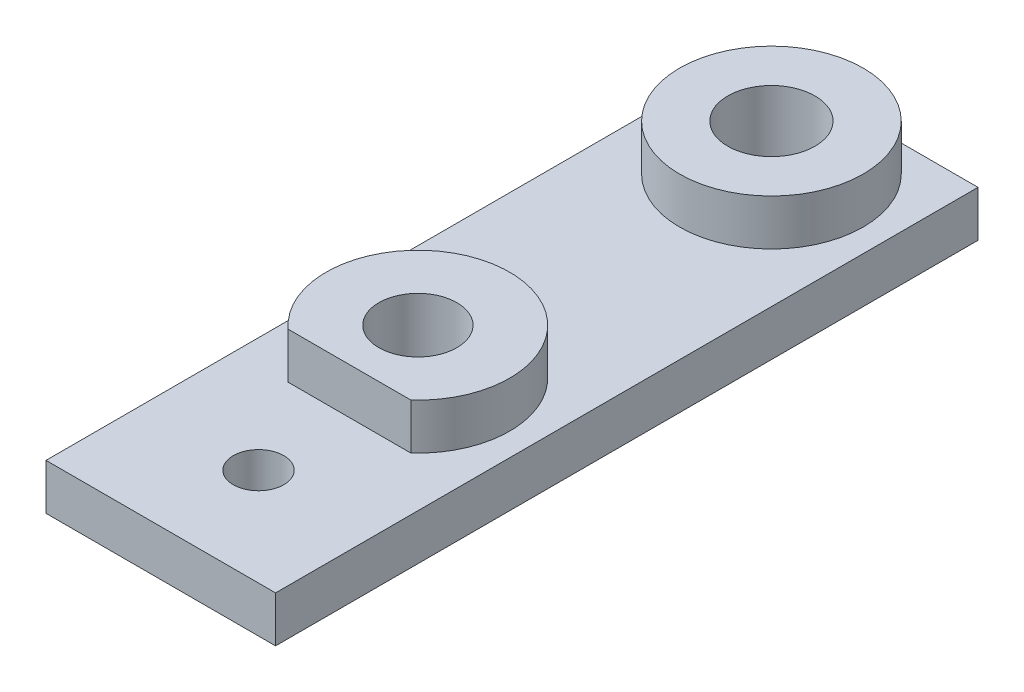
ISO-10303-21;
HEADER;
FILE_DESCRIPTION(('STEP AP214'),'2;1');
FILE_NAME('part.step','',(''),(''),'','','');
FILE_SCHEMA(('AUTOMOTIVE_DESIGN { 1 0 10303 214 1 1 1 1 }'));
ENDSEC;
DATA;
#1=APPLICATION_CONTEXT('core data for automotive mechanical design processes');
#2=APPLICATION_PROTOCOL_DEFINITION('international standard','automotive_design',2000,#1);
#3=PRODUCT_CONTEXT('',#1,'mechanical');
#4=PRODUCT('Part','Part','',(#3));
#5=PRODUCT_RELATED_PRODUCT_CATEGORY('part','',(#4));
#6=PRODUCT_DEFINITION_FORMATION('','',#4);
#7=PRODUCT_DEFINITION_CONTEXT('part definition',#1,'design');
#8=PRODUCT_DEFINITION('design','',#6,#7);
#9=PRODUCT_DEFINITION_SHAPE('','',#8);
#10=(LENGTH_UNIT() NAMED_UNIT(*) SI_UNIT(.MILLI.,.METRE.));
#11=(NAMED_UNIT(*) PLANE_ANGLE_UNIT() SI_UNIT($,.RADIAN.));
#12=(NAMED_UNIT(*) SI_UNIT($,.STERADIAN.) SOLID_ANGLE_UNIT());
#13=UNCERTAINTY_MEASURE_WITH_UNIT(LENGTH_MEASURE(1.E-05),#10,'distance_accuracy_value','');
#14=(GEOMETRIC_REPRESENTATION_CONTEXT(3) GLOBAL_UNCERTAINTY_ASSIGNED_CONTEXT((#13)) GLOBAL_UNIT_ASSIGNED_CONTEXT((#10,
#11,#12)) REPRESENTATION_CONTEXT('',''));
#15=CARTESIAN_POINT('',(0.,0.,0.));
#16=DIRECTION('',(0.,0.,1.));
#17=DIRECTION('',(1.,0.,0.));
#18=AXIS2_PLACEMENT_3D('',#15,#16,#17);
#19=CARTESIAN_POINT('',(0.,5.,0.));
#20=DIRECTION('',(0.,1.,0.));
#21=DIRECTION('',(0.,0.,1.));
#22=AXIS2_PLACEMENT_3D('',#19,#20,#21);
#23=PLANE('',#22);
#24=DIRECTION('',(-1.,0.,0.));
#25=VECTOR('',#24,1.);
#26=CARTESIAN_POINT('',(-39.4811320754717,5.,-27.2735849056604));
#27=LINE('',#26,#25);
#28=CARTESIAN_POINT('',(-14.4811320754717,5.,-27.2735849056603));
#29=VERTEX_POINT('',#28);
#30=CARTESIAN_POINT('',(-26.9811320754717,5.,-27.2735849056604));
#31=VERTEX_POINT('',#30);
#32=EDGE_CURVE('E87',#29,#31,#27,.T.);
#33=ORIENTED_EDGE('',*,*,#32,.T.);
#34=CARTESIAN_POINT('',(-26.9811320754717,5.,-17.2735849056604));
#35=DIRECTION('',(0.,1.,0.));
#36=DIRECTION('',(0.,0.,1.));
#37=AXIS2_PLACEMENT_3D('',#34,#35,#36);
#38=CIRCLE('',#37,10.);
#39=EDGE_CURVE('E119',#31,#31,#38,.T.);
#40=ORIENTED_EDGE('',*,*,#39,.F.);
#41=CARTESIAN_POINT('',(-39.4811320754717,5.,-27.2735849056604));
#42=VERTEX_POINT('',#41);
#43=EDGE_CURVE('E144',#31,#42,#27,.T.);
#44=ORIENTED_EDGE('',*,*,#43,.T.);
#45=DIRECTION('',(0.,0.,1.));
#46=VECTOR('',#45,1.);
#47=CARTESIAN_POINT('',(-39.4811320754717,5.,-27.2735849056604));
#48=LINE('',#47,#46);
#49=CARTESIAN_POINT('',(-39.4811320754717,5.,49.2264150943397));
#50=VERTEX_POINT('',#49);
#51=EDGE_CURVE('E146',#42,#50,#48,.T.);
#52=ORIENTED_EDGE('',*,*,#51,.T.);
#53=DIRECTION('',(1.,0.,0.));
#54=VECTOR('',#53,1.);
#55=CARTESIAN_POINT('',(-39.4811320754717,5.,49.2264150943397));
#56=LINE('',#55,#54);
#57=CARTESIAN_POINT('',(-14.4811320754717,5.,49.2264150943397));
#58=VERTEX_POINT('',#57);
#59=EDGE_CURVE('E59',#50,#58,#56,.T.);
#60=ORIENTED_EDGE('',*,*,#59,.T.);
#61=DIRECTION('',(0.,0.,-1.));
#62=VECTOR('',#61,1.);
#63=CARTESIAN_POINT('',(-14.4811320754717,5.,-27.2735849056603));
#64=LINE('',#63,#62);
#65=EDGE_CURVE('E142',#58,#29,#64,.T.);
#66=ORIENTED_EDGE('',*,*,#65,.T.);
#67=EDGE_LOOP('',(#33,#40,#44,#52,#60,#66));
#68=FACE_BOUND('',#67,.T.);
#69=CARTESIAN_POINT('',(-26.9811320754717,5.,38.5800085191015));
#70=DIRECTION('',(0.,-1.,0.));
#71=DIRECTION('',(0.,0.,-1.));
#72=AXIS2_PLACEMENT_3D('',#69,#70,#71);
#73=CIRCLE('',#72,2.75);
#74=CARTESIAN_POINT('',(-26.9811320754717,5.,35.8300085191015));
#75=VERTEX_POINT('',#74);
#76=EDGE_CURVE('E130',#75,#75,#73,.T.);
#77=ORIENTED_EDGE('',*,*,#76,.T.);
#78=EDGE_LOOP('',(#77));
#79=FACE_BOUND('',#78,.T.);
#80=DIRECTION('',(1.,0.,0.));
#81=VECTOR('',#80,1.);
#82=CARTESIAN_POINT('',(-33.6584511695804,5.,28.6704334792882));
#83=LINE('',#82,#81);
#84=CARTESIAN_POINT('',(-33.6584511695804,5.,28.6704334792882));
#85=VERTEX_POINT('',#84);
#86=CARTESIAN_POINT('',(-20.3038129813631,5.,28.6704334792882));
#87=VERTEX_POINT('',#86);
#88=EDGE_CURVE('E113',#85,#87,#83,.T.);
#89=ORIENTED_EDGE('',*,*,#88,.F.);
#90=CARTESIAN_POINT('',(-26.9811320754717,5.,21.2264150943396));
#91=DIRECTION('',(0.,1.,0.));
#92=DIRECTION('',(0.,0.,1.));
#93=AXIS2_PLACEMENT_3D('',#90,#91,#92);
#94=CIRCLE('',#93,10.);
#95=EDGE_CURVE('E50',#87,#85,#94,.T.);
#96=ORIENTED_EDGE('',*,*,#95,.F.);
#97=EDGE_LOOP('',(#89,#96));
#98=FACE_BOUND('',#97,.T.);
#99=ADVANCED_FACE('F35',(#68,#79,#98),#23,.T.);
#100=CARTESIAN_POINT('',(0.,0.,0.));
#101=DIRECTION('',(0.,1.,0.));
#102=DIRECTION('',(0.,0.,1.));
#103=AXIS2_PLACEMENT_3D('',#100,#101,#102);
#104=PLANE('',#103);
#105=CARTESIAN_POINT('',(-26.9811320754717,0.,38.5800085191015));
#106=DIRECTION('',(0.,-1.,0.));
#107=DIRECTION('',(0.,0.,-1.));
#108=AXIS2_PLACEMENT_3D('',#105,#106,#107);
#109=CIRCLE('',#108,2.75);
#110=CARTESIAN_POINT('',(-26.9811320754717,0.,35.8300085191015));
#111=VERTEX_POINT('',#110);
#112=EDGE_CURVE('E127',#111,#111,#109,.T.);
#113=ORIENTED_EDGE('',*,*,#112,.F.);
#114=EDGE_LOOP('',(#113));
#115=FACE_BOUND('',#114,.T.);
#116=DIRECTION('',(0.,0.,-1.));
#117=VECTOR('',#116,1.);
#118=CARTESIAN_POINT('',(-14.4811320754717,0.,-27.2735849056603));
#119=LINE('',#118,#117);
#120=CARTESIAN_POINT('',(-14.4811320754717,0.,49.2264150943397));
#121=VERTEX_POINT('',#120);
#122=CARTESIAN_POINT('',(-14.4811320754717,0.,-27.2735849056603));
#123=VERTEX_POINT('',#122);
#124=EDGE_CURVE('E141',#121,#123,#119,.T.);
#125=ORIENTED_EDGE('',*,*,#124,.F.);
#126=DIRECTION('',(1.,0.,0.));
#127=VECTOR('',#126,1.);
#128=CARTESIAN_POINT('',(-39.4811320754717,0.,49.2264150943397));
#129=LINE('',#128,#127);
#130=CARTESIAN_POINT('',(-39.4811320754717,0.,49.2264150943397));
#131=VERTEX_POINT('',#130);
#132=EDGE_CURVE('E80',#131,#121,#129,.T.);
#133=ORIENTED_EDGE('',*,*,#132,.F.);
#134=DIRECTION('',(0.,0.,1.));
#135=VECTOR('',#134,1.);
#136=CARTESIAN_POINT('',(-39.4811320754717,0.,-27.2735849056604));
#137=LINE('',#136,#135);
#138=CARTESIAN_POINT('',(-39.4811320754717,0.,-27.2735849056604));
#139=VERTEX_POINT('',#138);
#140=EDGE_CURVE('E154',#139,#131,#137,.T.);
#141=ORIENTED_EDGE('',*,*,#140,.F.);
#142=DIRECTION('',(-1.,0.,0.));
#143=VECTOR('',#142,1.);
#144=CARTESIAN_POINT('',(-39.4811320754717,0.,-27.2735849056604));
#145=LINE('',#144,#143);
#146=EDGE_CURVE('E152',#123,#139,#145,.T.);
#147=ORIENTED_EDGE('',*,*,#146,.F.);
#148=EDGE_LOOP('',(#125,#133,#141,#147));
#149=FACE_BOUND('',#148,.T.);
#150=CARTESIAN_POINT('',(-26.9811320754717,0.,-17.2735849056604));
#151=DIRECTION('',(0.,1.,0.));
#152=DIRECTION('',(0.,0.,1.));
#153=AXIS2_PLACEMENT_3D('',#150,#151,#152);
#154=CIRCLE('',#153,4.75);
#155=CARTESIAN_POINT('',(-26.9811320754717,0.,-12.5235849056604));
#156=VERTEX_POINT('',#155);
#157=EDGE_CURVE('E138',#156,#156,#154,.T.);
#158=ORIENTED_EDGE('',*,*,#157,.T.);
#159=EDGE_LOOP('',(#158));
#160=FACE_BOUND('',#159,.T.);
#161=CARTESIAN_POINT('',(-26.9811320754717,0.,21.2264150943396));
#162=DIRECTION('',(0.,1.,0.));
#163=DIRECTION('',(0.,0.,1.));
#164=AXIS2_PLACEMENT_3D('',#161,#162,#163);
#165=CIRCLE('',#164,4.25);
#166=CARTESIAN_POINT('',(-26.9811320754717,0.,25.4764150943396));
#167=VERTEX_POINT('',#166);
#168=EDGE_CURVE('E133',#167,#167,#165,.T.);
#169=ORIENTED_EDGE('',*,*,#168,.T.);
#170=EDGE_LOOP('',(#169));
#171=FACE_BOUND('',#170,.T.);
#172=ADVANCED_FACE('F168',(#115,#149,#160,#171),#104,.F.);
#173=CARTESIAN_POINT('',(-14.4811320754717,5.,-27.2735849056603));
#174=DIRECTION('',(-1.,0.,0.));
#175=DIRECTION('',(0.,0.,1.));
#176=AXIS2_PLACEMENT_3D('',#173,#174,#175);
#177=PLANE('',#176);
#178=ORIENTED_EDGE('',*,*,#124,.T.);
#179=DIRECTION('',(0.,-1.,0.));
#180=VECTOR('',#179,1.);
#181=CARTESIAN_POINT('',(-14.4811320754717,5.,-27.2735849056603));
#182=LINE('',#181,#180);
#183=EDGE_CURVE('E11',#29,#123,#182,.T.);
#184=ORIENTED_EDGE('',*,*,#183,.F.);
#185=ORIENTED_EDGE('',*,*,#65,.F.);
#186=DIRECTION('',(0.,-1.,0.));
#187=VECTOR('',#186,1.);
#188=CARTESIAN_POINT('',(-14.4811320754717,5.,49.2264150943397));
#189=LINE('',#188,#187);
#190=EDGE_CURVE('E149',#58,#121,#189,.T.);
#191=ORIENTED_EDGE('',*,*,#190,.T.);
#192=EDGE_LOOP('',(#178,#184,#185,#191));
#193=FACE_BOUND('',#192,.T.);
#194=ADVANCED_FACE('F37',(#193),#177,.F.);
#195=CARTESIAN_POINT('',(-39.4811320754717,5.,-27.2735849056604));
#196=DIRECTION('',(0.,0.,1.));
#197=DIRECTION('',(1.,0.,0.));
#198=AXIS2_PLACEMENT_3D('',#195,#196,#197);
#199=PLANE('',#198);
#200=ORIENTED_EDGE('',*,*,#146,.T.);
#201=DIRECTION('',(0.,-1.,0.));
#202=VECTOR('',#201,1.);
#203=CARTESIAN_POINT('',(-39.4811320754717,5.,-27.2735849056604));
#204=LINE('',#203,#202);
#205=EDGE_CURVE('E43',#42,#139,#204,.T.);
#206=ORIENTED_EDGE('',*,*,#205,.F.);
#207=ORIENTED_EDGE('',*,*,#43,.F.);
#208=ORIENTED_EDGE('',*,*,#32,.F.);
#209=ORIENTED_EDGE('',*,*,#183,.T.);
#210=EDGE_LOOP('',(#200,#206,#207,#208,#209));
#211=FACE_BOUND('',#210,.T.);
#212=ADVANCED_FACE('F184',(#211),#199,.F.);
#213=CARTESIAN_POINT('',(-39.4811320754717,5.,-27.2735849056604));
#214=DIRECTION('',(1.,0.,0.));
#215=DIRECTION('',(0.,0.,-1.));
#216=AXIS2_PLACEMENT_3D('',#213,#214,#215);
#217=PLANE('',#216);
#218=ORIENTED_EDGE('',*,*,#140,.T.);
#219=DIRECTION('',(0.,-1.,0.));
#220=VECTOR('',#219,1.);
#221=CARTESIAN_POINT('',(-39.4811320754717,5.,49.2264150943397));
#222=LINE('',#221,#220);
#223=EDGE_CURVE('E158',#50,#131,#222,.T.);
#224=ORIENTED_EDGE('',*,*,#223,.F.);
#225=ORIENTED_EDGE('',*,*,#51,.F.);
#226=ORIENTED_EDGE('',*,*,#205,.T.);
#227=EDGE_LOOP('',(#218,#224,#225,#226));
#228=FACE_BOUND('',#227,.T.);
#229=ADVANCED_FACE('F164',(#228),#217,.F.);
#230=CARTESIAN_POINT('',(-39.4811320754717,5.,49.2264150943397));
#231=DIRECTION('',(0.,0.,-1.));
#232=DIRECTION('',(-1.,0.,0.));
#233=AXIS2_PLACEMENT_3D('',#230,#231,#232);
#234=PLANE('',#233);
#235=ORIENTED_EDGE('',*,*,#132,.T.);
#236=ORIENTED_EDGE('',*,*,#190,.F.);
#237=ORIENTED_EDGE('',*,*,#59,.F.);
#238=ORIENTED_EDGE('',*,*,#223,.T.);
#239=EDGE_LOOP('',(#235,#236,#237,#238));
#240=FACE_BOUND('',#239,.T.);
#241=ADVANCED_FACE('F173',(#240),#234,.F.);
#242=CARTESIAN_POINT('',(-26.9811320754717,5.,-17.2735849056604));
#243=DIRECTION('',(0.,-1.,0.));
#244=DIRECTION('',(0.,0.,-1.));
#245=AXIS2_PLACEMENT_3D('',#242,#243,#244);
#246=CYLINDRICAL_SURFACE('',#245,4.75);
#247=ORIENTED_EDGE('',*,*,#157,.F.);
#248=EDGE_LOOP('',(#247));
#249=FACE_BOUND('',#248,.T.);
#250=CARTESIAN_POINT('',(-26.9811320754717,10.,-17.2735849056604));
#251=DIRECTION('',(0.,1.,0.));
#252=DIRECTION('',(0.,0.,1.));
#253=AXIS2_PLACEMENT_3D('',#250,#251,#252);
#254=CIRCLE('',#253,4.75);
#255=CARTESIAN_POINT('',(-26.9811320754717,10.,-12.5235849056604));
#256=VERTEX_POINT('',#255);
#257=EDGE_CURVE('E116',#256,#256,#254,.T.);
#258=ORIENTED_EDGE('',*,*,#257,.T.);
#259=EDGE_LOOP('',(#258));
#260=FACE_BOUND('',#259,.T.);
#261=ADVANCED_FACE('F175',(#249,#260),#246,.F.);
#262=CARTESIAN_POINT('',(-26.9811320754717,5.,21.2264150943396));
#263=DIRECTION('',(0.,-1.,0.));
#264=DIRECTION('',(0.,0.,-1.));
#265=AXIS2_PLACEMENT_3D('',#262,#263,#264);
#266=CYLINDRICAL_SURFACE('',#265,4.25);
#267=ORIENTED_EDGE('',*,*,#168,.F.);
#268=EDGE_LOOP('',(#267));
#269=FACE_BOUND('',#268,.T.);
#270=CARTESIAN_POINT('',(-26.9811320754717,10.,21.2264150943396));
#271=DIRECTION('',(0.,1.,0.));
#272=DIRECTION('',(0.,0.,1.));
#273=AXIS2_PLACEMENT_3D('',#270,#271,#272);
#274=CIRCLE('',#273,4.25);
#275=CARTESIAN_POINT('',(-26.9811320754717,10.,25.4764150943396));
#276=VERTEX_POINT('',#275);
#277=EDGE_CURVE('E313',#276,#276,#274,.T.);
#278=ORIENTED_EDGE('',*,*,#277,.T.);
#279=EDGE_LOOP('',(#278));
#280=FACE_BOUND('',#279,.T.);
#281=ADVANCED_FACE('F181',(#269,#280),#266,.F.);
#282=CARTESIAN_POINT('',(-26.9811320754717,5.,38.5800085191015));
#283=DIRECTION('',(0.,-1.,0.));
#284=DIRECTION('',(0.,0.,-1.));
#285=AXIS2_PLACEMENT_3D('',#282,#283,#284);
#286=CYLINDRICAL_SURFACE('',#285,2.75);
#287=ORIENTED_EDGE('',*,*,#76,.F.);
#288=EDGE_LOOP('',(#287));
#289=FACE_BOUND('',#288,.T.);
#290=ORIENTED_EDGE('',*,*,#112,.T.);
#291=EDGE_LOOP('',(#290));
#292=FACE_BOUND('',#291,.T.);
#293=ADVANCED_FACE('F197',(#289,#292),#286,.F.);
#294=CARTESIAN_POINT('',(-26.9811320754717,10.,-17.2735849056604));
#295=DIRECTION('',(0.,1.,0.));
#296=DIRECTION('',(0.,0.,1.));
#297=AXIS2_PLACEMENT_3D('',#294,#295,#296);
#298=PLANE('',#297);
#299=CARTESIAN_POINT('',(-26.9811320754717,10.,-17.2735849056604));
#300=DIRECTION('',(0.,1.,0.));
#301=DIRECTION('',(0.,0.,1.));
#302=AXIS2_PLACEMENT_3D('',#299,#300,#301);
#303=CIRCLE('',#302,10.);
#304=CARTESIAN_POINT('',(-26.9811320754717,10.,-7.27358490566035));
#305=VERTEX_POINT('',#304);
#306=EDGE_CURVE('E124',#305,#305,#303,.T.);
#307=ORIENTED_EDGE('',*,*,#306,.T.);
#308=EDGE_LOOP('',(#307));
#309=FACE_BOUND('',#308,.T.);
#310=ORIENTED_EDGE('',*,*,#257,.F.);
#311=EDGE_LOOP('',(#310));
#312=FACE_BOUND('',#311,.T.);
#313=ADVANCED_FACE('F201',(#309,#312),#298,.T.);
#314=CARTESIAN_POINT('',(-26.9811320754717,10.,-17.2735849056604));
#315=DIRECTION('',(0.,-1.,0.));
#316=DIRECTION('',(0.,0.,-1.));
#317=AXIS2_PLACEMENT_3D('',#314,#315,#316);
#318=CYLINDRICAL_SURFACE('',#317,10.);
#319=ORIENTED_EDGE('',*,*,#306,.F.);
#320=EDGE_LOOP('',(#319));
#321=FACE_BOUND('',#320,.T.);
#322=ORIENTED_EDGE('',*,*,#39,.T.);
#323=EDGE_LOOP('',(#322));
#324=FACE_BOUND('',#323,.T.);
#325=ADVANCED_FACE('F203',(#321,#324),#318,.T.);
#326=CARTESIAN_POINT('',(-26.9811320754717,10.,21.2264150943396));
#327=DIRECTION('',(0.,1.,0.));
#328=DIRECTION('',(0.,0.,1.));
#329=AXIS2_PLACEMENT_3D('',#326,#327,#328);
#330=PLANE('',#329);
#331=CARTESIAN_POINT('',(-26.9811320754717,10.,21.2264150943396));
#332=DIRECTION('',(0.,1.,0.));
#333=DIRECTION('',(0.,0.,1.));
#334=AXIS2_PLACEMENT_3D('',#331,#332,#333);
#335=CIRCLE('',#334,10.);
#336=CARTESIAN_POINT('',(-20.3038129813631,10.,28.6704334792882));
#337=VERTEX_POINT('',#336);
#338=CARTESIAN_POINT('',(-33.6584511695804,10.,28.6704334792882));
#339=VERTEX_POINT('',#338);
#340=EDGE_CURVE('E109',#337,#339,#335,.T.);
#341=ORIENTED_EDGE('',*,*,#340,.T.);
#342=DIRECTION('',(1.,0.,0.));
#343=VECTOR('',#342,1.);
#344=CARTESIAN_POINT('',(-33.6584511695804,10.,28.6704334792882));
#345=LINE('',#344,#343);
#346=EDGE_CURVE('E101',#339,#337,#345,.T.);
#347=ORIENTED_EDGE('',*,*,#346,.T.);
#348=EDGE_LOOP('',(#341,#347));
#349=FACE_BOUND('',#348,.T.);
#350=ORIENTED_EDGE('',*,*,#277,.F.);
#351=EDGE_LOOP('',(#350));
#352=FACE_BOUND('',#351,.T.);
#353=ADVANCED_FACE('F111',(#349,#352),#330,.T.);
#354=CARTESIAN_POINT('',(-26.9811320754717,10.,21.2264150943396));
#355=DIRECTION('',(0.,-1.,0.));
#356=DIRECTION('',(0.,0.,-1.));
#357=AXIS2_PLACEMENT_3D('',#354,#355,#356);
#358=CYLINDRICAL_SURFACE('',#357,10.);
#359=ORIENTED_EDGE('',*,*,#95,.T.);
#360=DIRECTION('',(0.,-1.,0.));
#361=VECTOR('',#360,1.);
#362=CARTESIAN_POINT('',(-33.6584511695804,10.,28.6704334792882));
#363=LINE('',#362,#361);
#364=EDGE_CURVE('E104',#339,#85,#363,.T.);
#365=ORIENTED_EDGE('',*,*,#364,.F.);
#366=ORIENTED_EDGE('',*,*,#340,.F.);
#367=DIRECTION('',(0.,-1.,0.));
#368=VECTOR('',#367,1.);
#369=CARTESIAN_POINT('',(-20.3038129813631,10.,28.6704334792882));
#370=LINE('',#369,#368);
#371=EDGE_CURVE('E106',#337,#87,#370,.T.);
#372=ORIENTED_EDGE('',*,*,#371,.T.);
#373=EDGE_LOOP('',(#359,#365,#366,#372));
#374=FACE_BOUND('',#373,.T.);
#375=ADVANCED_FACE('F115',(#374),#358,.T.);
#376=CARTESIAN_POINT('',(-33.6584511695804,10.,28.6704334792882));
#377=DIRECTION('',(0.,0.,-1.));
#378=DIRECTION('',(-1.,0.,0.));
#379=AXIS2_PLACEMENT_3D('',#376,#377,#378);
#380=PLANE('',#379);
#381=ORIENTED_EDGE('',*,*,#88,.T.);
#382=ORIENTED_EDGE('',*,*,#371,.F.);
#383=ORIENTED_EDGE('',*,*,#346,.F.);
#384=ORIENTED_EDGE('',*,*,#364,.T.);
#385=EDGE_LOOP('',(#381,#382,#383,#384));
#386=FACE_BOUND('',#385,.T.);
#387=ADVANCED_FACE('F103',(#386),#380,.F.);
#388=CLOSED_SHELL('',(#99,#172,#194,#212,#229,#241,#261,#281,#293,#313,#325,#353,#375,#387));
#389=MANIFOLD_SOLID_BREP('B2',#388);
#390=ADVANCED_BREP_SHAPE_REPRESENTATION('',(#18,#389),#14);
#391=SHAPE_DEFINITION_REPRESENTATION(#9,#390);
ENDSEC;
END-ISO-10303-21;
